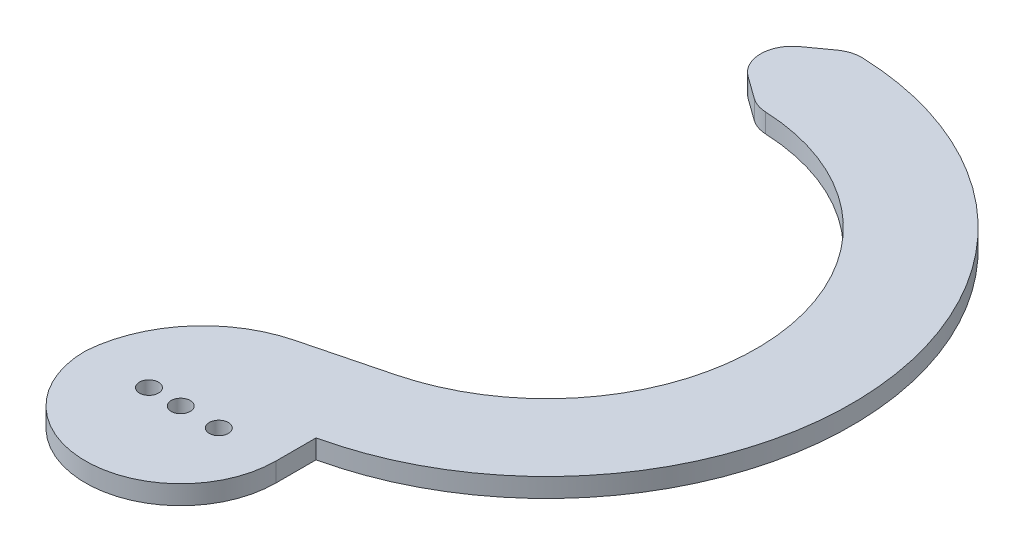
ISO-10303-21;
HEADER;
FILE_DESCRIPTION(('STEP AP214'),'2;1');
FILE_NAME('part.step','',(''),(''),'','','');
FILE_SCHEMA(('AUTOMOTIVE_DESIGN { 1 0 10303 214 1 1 1 1 }'));
ENDSEC;
DATA;
#1=APPLICATION_CONTEXT('core data for automotive mechanical design processes');
#2=APPLICATION_PROTOCOL_DEFINITION('international standard','automotive_design',2000,#1);
#3=PRODUCT_CONTEXT('',#1,'mechanical');
#4=PRODUCT('Part','Part','',(#3));
#5=PRODUCT_RELATED_PRODUCT_CATEGORY('part','',(#4));
#6=PRODUCT_DEFINITION_FORMATION('','',#4);
#7=PRODUCT_DEFINITION_CONTEXT('part definition',#1,'design');
#8=PRODUCT_DEFINITION('design','',#6,#7);
#9=PRODUCT_DEFINITION_SHAPE('','',#8);
#10=(LENGTH_UNIT() NAMED_UNIT(*) SI_UNIT(.MILLI.,.METRE.));
#11=(NAMED_UNIT(*) PLANE_ANGLE_UNIT() SI_UNIT($,.RADIAN.));
#12=(NAMED_UNIT(*) SI_UNIT($,.STERADIAN.) SOLID_ANGLE_UNIT());
#13=UNCERTAINTY_MEASURE_WITH_UNIT(LENGTH_MEASURE(1.E-05),#10,'distance_accuracy_value','');
#14=(GEOMETRIC_REPRESENTATION_CONTEXT(3) GLOBAL_UNCERTAINTY_ASSIGNED_CONTEXT((#13)) GLOBAL_UNIT_ASSIGNED_CONTEXT((#10,
#11,#12)) REPRESENTATION_CONTEXT('',''));
#15=CARTESIAN_POINT('',(0.,0.,0.));
#16=DIRECTION('',(0.,0.,1.));
#17=DIRECTION('',(1.,0.,0.));
#18=AXIS2_PLACEMENT_3D('',#15,#16,#17);
#19=CARTESIAN_POINT('',(10.5,3.,0.));
#20=DIRECTION('',(-1.,0.,0.));
#21=DIRECTION('',(0.,0.,1.));
#22=AXIS2_PLACEMENT_3D('',#19,#20,#21);
#23=PLANE('',#22);
#24=DIRECTION('',(0.,0.,-1.));
#25=VECTOR('',#24,1.);
#26=CARTESIAN_POINT('',(10.5,0.,0.));
#27=LINE('',#26,#25);
#28=CARTESIAN_POINT('',(10.5,0.,53.14));
#29=VERTEX_POINT('',#28);
#30=CARTESIAN_POINT('',(10.5,0.,46.837484987988));
#31=VERTEX_POINT('',#30);
#32=EDGE_CURVE('E176',#29,#31,#27,.T.);
#33=ORIENTED_EDGE('',*,*,#32,.T.);
#34=DIRECTION('',(0.,-1.,0.));
#35=VECTOR('',#34,1.);
#36=CARTESIAN_POINT('',(10.5,3.,46.837484987988));
#37=LINE('',#36,#35);
#38=CARTESIAN_POINT('',(10.5,3.,46.837484987988));
#39=VERTEX_POINT('',#38);
#40=EDGE_CURVE('E211',#39,#31,#37,.T.);
#41=ORIENTED_EDGE('',*,*,#40,.F.);
#42=DIRECTION('',(0.,0.,-1.));
#43=VECTOR('',#42,1.);
#44=CARTESIAN_POINT('',(10.5,3.,0.));
#45=LINE('',#44,#43);
#46=CARTESIAN_POINT('',(10.5,3.,53.14));
#47=VERTEX_POINT('',#46);
#48=EDGE_CURVE('E320',#47,#39,#45,.T.);
#49=ORIENTED_EDGE('',*,*,#48,.F.);
#50=DIRECTION('',(0.,-1.,0.));
#51=VECTOR('',#50,1.);
#52=CARTESIAN_POINT('',(10.5,3.,53.14));
#53=LINE('',#52,#51);
#54=EDGE_CURVE('E172',#47,#29,#53,.T.);
#55=ORIENTED_EDGE('',*,*,#54,.T.);
#56=EDGE_LOOP('',(#33,#41,#49,#55));
#57=FACE_BOUND('',#56,.T.);
#58=ADVANCED_FACE('F45',(#57),#23,.F.);
#59=CARTESIAN_POINT('',(0.,3.,0.));
#60=DIRECTION('',(0.,-1.,0.));
#61=DIRECTION('',(0.,0.,-1.));
#62=AXIS2_PLACEMENT_3D('',#59,#60,#61);
#63=CYLINDRICAL_SURFACE('',#62,48.);
#64=CARTESIAN_POINT('',(0.,0.,0.));
#65=DIRECTION('',(0.,1.,0.));
#66=DIRECTION('',(0.,0.,1.));
#67=AXIS2_PLACEMENT_3D('',#64,#65,#66);
#68=CIRCLE('',#67,48.);
#69=CARTESIAN_POINT('',(1.75489275571207,0.,-47.9679096002312));
#70=VERTEX_POINT('',#69);
#71=EDGE_CURVE('E180',#31,#70,#68,.T.);
#72=ORIENTED_EDGE('',*,*,#71,.T.);
#73=DIRECTION('',(0.,-1.,0.));
#74=VECTOR('',#73,1.);
#75=CARTESIAN_POINT('',(1.75489275571207,3.,-47.9679096002312));
#76=LINE('',#75,#74);
#77=CARTESIAN_POINT('',(1.75489275571207,3.,-47.9679096002312));
#78=VERTEX_POINT('',#77);
#79=EDGE_CURVE('E239',#70,#78,#76,.F.);
#80=ORIENTED_EDGE('',*,*,#79,.T.);
#81=CARTESIAN_POINT('',(0.,3.,0.));
#82=DIRECTION('',(0.,1.,0.));
#83=DIRECTION('',(0.,0.,1.));
#84=AXIS2_PLACEMENT_3D('',#81,#82,#83);
#85=CIRCLE('',#84,48.);
#86=EDGE_CURVE('E319',#39,#78,#85,.T.);
#87=ORIENTED_EDGE('',*,*,#86,.F.);
#88=ORIENTED_EDGE('',*,*,#40,.T.);
#89=EDGE_LOOP('',(#72,#80,#87,#88));
#90=FACE_BOUND('',#89,.T.);
#91=ADVANCED_FACE('F271',(#90),#63,.T.);
#92=CARTESIAN_POINT('',(-22.7569674268065,3.,-31.6236758545514));
#93=DIRECTION('',(-0.584100521911124,0.,-0.811681329280866));
#94=DIRECTION('',(-0.811681329280866,0.,0.584100521911124));
#95=AXIS2_PLACEMENT_3D('',#92,#93,#94);
#96=PLANE('',#95);
#97=DIRECTION('',(0.811681329280866,0.,-0.584100521911124));
#98=VECTOR('',#97,1.);
#99=CARTESIAN_POINT('',(-22.7569674268065,3.,-31.6236758545514));
#100=LINE('',#99,#98);
#101=CARTESIAN_POINT('',(-4.78252794390728,3.,-44.5584066464043));
#102=VERTEX_POINT('',#101);
#103=CARTESIAN_POINT('',(-1.34841118256355,3.,-47.0296589966115));
#104=VERTEX_POINT('',#103);
#105=EDGE_CURVE('E161',#102,#104,#100,.T.);
#106=ORIENTED_EDGE('',*,*,#105,.T.);
#107=DIRECTION('',(0.,1.,0.));
#108=VECTOR('',#107,1.);
#109=CARTESIAN_POINT('',(-1.34841118256356,0.,-47.0296589966115));
#110=LINE('',#109,#108);
#111=CARTESIAN_POINT('',(-1.34841118256355,0.,-47.0296589966115));
#112=VERTEX_POINT('',#111);
#113=EDGE_CURVE('E229',#104,#112,#110,.F.);
#114=ORIENTED_EDGE('',*,*,#113,.T.);
#115=DIRECTION('',(0.811681329280866,0.,-0.584100521911124));
#116=VECTOR('',#115,1.);
#117=CARTESIAN_POINT('',(-22.7569674268065,0.,-31.6236758545514));
#118=LINE('',#117,#116);
#119=CARTESIAN_POINT('',(-4.78252794390728,0.,-44.5584066464043));
#120=VERTEX_POINT('',#119);
#121=EDGE_CURVE('E184',#120,#112,#118,.T.);
#122=ORIENTED_EDGE('',*,*,#121,.F.);
#123=DIRECTION('',(0.,-1.,0.));
#124=VECTOR('',#123,1.);
#125=CARTESIAN_POINT('',(-4.78252794390729,3.,-44.5584066464043));
#126=LINE('',#125,#124);
#127=EDGE_CURVE('E222',#120,#102,#126,.F.);
#128=ORIENTED_EDGE('',*,*,#127,.T.);
#129=EDGE_LOOP('',(#106,#114,#122,#128));
#130=FACE_BOUND('',#129,.T.);
#131=ADVANCED_FACE('F277',(#130),#96,.T.);
#132=CARTESIAN_POINT('',(15.6454151059294,3.,-21.741277150004));
#133=DIRECTION('',(-0.584100521911124,0.,0.811681329280866));
#134=DIRECTION('',(0.811681329280866,0.,0.584100521911124));
#135=AXIS2_PLACEMENT_3D('',#132,#133,#134);
#136=PLANE('',#135);
#137=DIRECTION('',(-0.811681329280866,0.,-0.584100521911124));
#138=VECTOR('',#137,1.);
#139=CARTESIAN_POINT('',(15.6454151059294,0.,-21.741277150004));
#140=LINE('',#139,#138);
#141=CARTESIAN_POINT('',(-1.25789516049757,0.,-33.9052040415997));
#142=VERTEX_POINT('',#141);
#143=CARTESIAN_POINT('',(-4.7825279439073,0.,-36.4415933535957));
#144=VERTEX_POINT('',#143);
#145=EDGE_CURVE('E188',#142,#144,#140,.T.);
#146=ORIENTED_EDGE('',*,*,#145,.F.);
#147=DIRECTION('',(0.,-1.,0.));
#148=VECTOR('',#147,1.);
#149=CARTESIAN_POINT('',(-1.25789516049755,3.,-33.9052040415997));
#150=LINE('',#149,#148);
#151=CARTESIAN_POINT('',(-1.25789516049757,3.,-33.9052040415997));
#152=VERTEX_POINT('',#151);
#153=EDGE_CURVE('E250',#142,#152,#150,.F.);
#154=ORIENTED_EDGE('',*,*,#153,.T.);
#155=DIRECTION('',(-0.811681329280866,0.,-0.584100521911124));
#156=VECTOR('',#155,1.);
#157=CARTESIAN_POINT('',(15.6454151059294,3.,-21.741277150004));
#158=LINE('',#157,#156);
#159=CARTESIAN_POINT('',(-4.7825279439073,3.,-36.4415933535957));
#160=VERTEX_POINT('',#159);
#161=EDGE_CURVE('E155',#152,#160,#158,.T.);
#162=ORIENTED_EDGE('',*,*,#161,.T.);
#163=DIRECTION('',(0.,-1.,0.));
#164=VECTOR('',#163,1.);
#165=CARTESIAN_POINT('',(-4.78252794390729,3.,-36.4415933535957));
#166=LINE('',#165,#164);
#167=EDGE_CURVE('E215',#160,#144,#166,.T.);
#168=ORIENTED_EDGE('',*,*,#167,.T.);
#169=EDGE_LOOP('',(#146,#154,#162,#168));
#170=FACE_BOUND('',#169,.T.);
#171=ADVANCED_FACE('F305',(#170),#136,.T.);
#172=CARTESIAN_POINT('',(0.,3.,0.));
#173=DIRECTION('',(0.,-1.,0.));
#174=DIRECTION('',(0.,0.,-1.));
#175=AXIS2_PLACEMENT_3D('',#172,#173,#174);
#176=CYLINDRICAL_SURFACE('',#175,32.9999999999999);
#177=DIRECTION('',(0.,1.,0.));
#178=VECTOR('',#177,1.);
#179=CARTESIAN_POINT('',(8.20157023213472,-7.,31.9645779845027));
#180=LINE('',#179,#178);
#181=CARTESIAN_POINT('',(8.20157023213473,0.,31.9645779845027));
#182=VERTEX_POINT('',#181);
#183=CARTESIAN_POINT('',(8.20157023213472,3.,31.9645779845027));
#184=VERTEX_POINT('',#183);
#185=EDGE_CURVE('E131',#182,#184,#180,.T.);
#186=ORIENTED_EDGE('',*,*,#185,.T.);
#187=CARTESIAN_POINT('',(0.,3.,0.));
#188=DIRECTION('',(0.,1.,0.));
#189=DIRECTION('',(0.,0.,1.));
#190=AXIS2_PLACEMENT_3D('',#187,#188,#189);
#191=CIRCLE('',#190,32.9999999999999);
#192=CARTESIAN_POINT('',(1.4438433110241,3.,-32.9683987553719));
#193=VERTEX_POINT('',#192);
#194=EDGE_CURVE('E141',#184,#193,#191,.T.);
#195=ORIENTED_EDGE('',*,*,#194,.T.);
#196=DIRECTION('',(0.,-1.,0.));
#197=VECTOR('',#196,1.);
#198=CARTESIAN_POINT('',(1.4438433110241,3.,-32.9683987553719));
#199=LINE('',#198,#197);
#200=CARTESIAN_POINT('',(1.4438433110241,0.,-32.9683987553719));
#201=VERTEX_POINT('',#200);
#202=EDGE_CURVE('E247',#193,#201,#199,.T.);
#203=ORIENTED_EDGE('',*,*,#202,.T.);
#204=CARTESIAN_POINT('',(0.,0.,0.));
#205=DIRECTION('',(0.,1.,0.));
#206=DIRECTION('',(0.,0.,1.));
#207=AXIS2_PLACEMENT_3D('',#204,#205,#206);
#208=CIRCLE('',#207,32.9999999999999);
#209=EDGE_CURVE('E143',#182,#201,#208,.T.);
#210=ORIENTED_EDGE('',*,*,#209,.F.);
#211=EDGE_LOOP('',(#186,#195,#203,#210));
#212=FACE_BOUND('',#211,.T.);
#213=ADVANCED_FACE('F139',(#212),#176,.F.);
#214=CARTESIAN_POINT('',(-4.5,3.,53.14));
#215=DIRECTION('',(0.,-1.,0.));
#216=DIRECTION('',(0.,0.,-1.));
#217=AXIS2_PLACEMENT_3D('',#214,#215,#216);
#218=CYLINDRICAL_SURFACE('',#217,1.5);
#219=CARTESIAN_POINT('',(-4.5,3.,53.14));
#220=DIRECTION('',(0.,1.,0.));
#221=DIRECTION('',(0.,0.,1.));
#222=AXIS2_PLACEMENT_3D('',#219,#220,#221);
#223=CIRCLE('',#222,1.5);
#224=CARTESIAN_POINT('',(-4.5,3.,54.64));
#225=VERTEX_POINT('',#224);
#226=EDGE_CURVE('E159',#225,#225,#223,.T.);
#227=ORIENTED_EDGE('',*,*,#226,.T.);
#228=EDGE_LOOP('',(#227));
#229=FACE_BOUND('',#228,.T.);
#230=CARTESIAN_POINT('',(-4.5,0.,53.14));
#231=DIRECTION('',(0.,1.,0.));
#232=DIRECTION('',(0.,0.,1.));
#233=AXIS2_PLACEMENT_3D('',#230,#231,#232);
#234=CIRCLE('',#233,1.5);
#235=CARTESIAN_POINT('',(-4.5,0.,54.64));
#236=VERTEX_POINT('',#235);
#237=EDGE_CURVE('E196',#236,#236,#234,.T.);
#238=ORIENTED_EDGE('',*,*,#237,.F.);
#239=EDGE_LOOP('',(#238));
#240=FACE_BOUND('',#239,.T.);
#241=ADVANCED_FACE('F349',(#229,#240),#218,.F.);
#242=CARTESIAN_POINT('',(-4.5,3.,53.14));
#243=DIRECTION('',(0.,-1.,0.));
#244=DIRECTION('',(0.,0.,-1.));
#245=AXIS2_PLACEMENT_3D('',#242,#243,#244);
#246=CYLINDRICAL_SURFACE('',#245,15.);
#247=CARTESIAN_POINT('',(-4.5,0.,53.14));
#248=DIRECTION('',(0.,1.,0.));
#249=DIRECTION('',(0.,0.,1.));
#250=AXIS2_PLACEMENT_3D('',#247,#248,#249);
#251=CIRCLE('',#250,15.);
#252=CARTESIAN_POINT('',(-19.5,0.,53.14));
#253=VERTEX_POINT('',#252);
#254=EDGE_CURVE('E193',#253,#29,#251,.T.);
#255=ORIENTED_EDGE('',*,*,#254,.T.);
#256=ORIENTED_EDGE('',*,*,#54,.F.);
#257=CARTESIAN_POINT('',(-4.5,3.,53.14));
#258=DIRECTION('',(0.,1.,0.));
#259=DIRECTION('',(0.,0.,1.));
#260=AXIS2_PLACEMENT_3D('',#257,#258,#259);
#261=CIRCLE('',#260,15.);
#262=CARTESIAN_POINT('',(-19.5,3.,53.14));
#263=VERTEX_POINT('',#262);
#264=EDGE_CURVE('E154',#263,#47,#261,.T.);
#265=ORIENTED_EDGE('',*,*,#264,.F.);
#266=DIRECTION('',(0.,-1.,0.));
#267=VECTOR('',#266,1.);
#268=CARTESIAN_POINT('',(-19.5,3.,53.14));
#269=LINE('',#268,#267);
#270=EDGE_CURVE('E208',#263,#253,#269,.T.);
#271=ORIENTED_EDGE('',*,*,#270,.T.);
#272=EDGE_LOOP('',(#255,#256,#265,#271));
#273=FACE_BOUND('',#272,.T.);
#274=ADVANCED_FACE('F262',(#273),#246,.T.);
#275=CARTESIAN_POINT('',(1.5,3.,53.14));
#276=DIRECTION('',(0.,-1.,0.));
#277=DIRECTION('',(0.,0.,-1.));
#278=AXIS2_PLACEMENT_3D('',#275,#276,#277);
#279=CYLINDRICAL_SURFACE('',#278,1.5);
#280=CARTESIAN_POINT('',(1.5,3.,53.14));
#281=DIRECTION('',(0.,1.,0.));
#282=DIRECTION('',(0.,0.,1.));
#283=AXIS2_PLACEMENT_3D('',#280,#281,#282);
#284=CIRCLE('',#283,1.5);
#285=CARTESIAN_POINT('',(1.5,3.,54.64));
#286=VERTEX_POINT('',#285);
#287=EDGE_CURVE('E204',#286,#286,#284,.T.);
#288=ORIENTED_EDGE('',*,*,#287,.T.);
#289=EDGE_LOOP('',(#288));
#290=FACE_BOUND('',#289,.T.);
#291=CARTESIAN_POINT('',(1.5,0.,53.14));
#292=DIRECTION('',(0.,1.,0.));
#293=DIRECTION('',(0.,0.,1.));
#294=AXIS2_PLACEMENT_3D('',#291,#292,#293);
#295=CIRCLE('',#294,1.5);
#296=CARTESIAN_POINT('',(1.5,0.,54.64));
#297=VERTEX_POINT('',#296);
#298=EDGE_CURVE('E145',#297,#297,#295,.T.);
#299=ORIENTED_EDGE('',*,*,#298,.F.);
#300=EDGE_LOOP('',(#299));
#301=FACE_BOUND('',#300,.T.);
#302=ADVANCED_FACE('F282',(#290,#301),#279,.F.);
#303=CARTESIAN_POINT('',(-9.50000000000001,3.,53.14));
#304=DIRECTION('',(0.,-1.,0.));
#305=DIRECTION('',(0.,0.,-1.));
#306=AXIS2_PLACEMENT_3D('',#303,#304,#305);
#307=CYLINDRICAL_SURFACE('',#306,1.5);
#308=CARTESIAN_POINT('',(-9.50000000000001,3.,53.14));
#309=DIRECTION('',(0.,1.,0.));
#310=DIRECTION('',(0.,0.,1.));
#311=AXIS2_PLACEMENT_3D('',#308,#309,#310);
#312=CIRCLE('',#311,1.5);
#313=CARTESIAN_POINT('',(-9.50000000000001,3.,54.64));
#314=VERTEX_POINT('',#313);
#315=EDGE_CURVE('E168',#314,#314,#312,.T.);
#316=ORIENTED_EDGE('',*,*,#315,.T.);
#317=EDGE_LOOP('',(#316));
#318=FACE_BOUND('',#317,.T.);
#319=CARTESIAN_POINT('',(-9.50000000000001,0.,53.14));
#320=DIRECTION('',(0.,1.,0.));
#321=DIRECTION('',(0.,0.,1.));
#322=AXIS2_PLACEMENT_3D('',#319,#320,#321);
#323=CIRCLE('',#322,1.5);
#324=CARTESIAN_POINT('',(-9.50000000000001,0.,54.64));
#325=VERTEX_POINT('',#324);
#326=EDGE_CURVE('E200',#325,#325,#323,.T.);
#327=ORIENTED_EDGE('',*,*,#326,.F.);
#328=EDGE_LOOP('',(#327));
#329=FACE_BOUND('',#328,.T.);
#330=ADVANCED_FACE('F285',(#318,#329),#307,.F.);
#331=CARTESIAN_POINT('',(0.,3.,0.));
#332=DIRECTION('',(0.,1.,0.));
#333=DIRECTION('',(0.,0.,1.));
#334=AXIS2_PLACEMENT_3D('',#331,#332,#333);
#335=PLANE('',#334);
#336=DIRECTION('',(0.968623575287964,0.,-0.248532431276811));
#337=VECTOR('',#336,1.);
#338=CARTESIAN_POINT('',(8.20157023213472,3.,31.9645779845027));
#339=LINE('',#338,#337);
#340=CARTESIAN_POINT('',(-4.52417540837722,3.,35.2297891403498));
#341=VERTEX_POINT('',#340);
#342=EDGE_CURVE('E128',#341,#184,#339,.T.);
#343=ORIENTED_EDGE('',*,*,#342,.F.);
#344=CARTESIAN_POINT('',(0.446473217158991,3.,54.602260646109));
#345=DIRECTION('',(0.,1.,0.));
#346=DIRECTION('',(0.,0.,1.));
#347=AXIS2_PLACEMENT_3D('',#344,#345,#346);
#348=CIRCLE('',#347,20.);
#349=EDGE_CURVE('E54',#341,#263,#348,.T.);
#350=ORIENTED_EDGE('',*,*,#349,.T.);
#351=ORIENTED_EDGE('',*,*,#264,.T.);
#352=ORIENTED_EDGE('',*,*,#48,.T.);
#353=ORIENTED_EDGE('',*,*,#86,.T.);
#354=CARTESIAN_POINT('',(1.57209142699206,3.,-42.9712523502071));
#355=DIRECTION('',(0.,1.,0.));
#356=DIRECTION('',(0.,0.,1.));
#357=AXIS2_PLACEMENT_3D('',#354,#355,#356);
#358=CIRCLE('',#357,5.);
#359=EDGE_CURVE('E244',#78,#104,#358,.T.);
#360=ORIENTED_EDGE('',*,*,#359,.T.);
#361=ORIENTED_EDGE('',*,*,#105,.F.);
#362=CARTESIAN_POINT('',(-1.86202533435167,3.,-40.5));
#363=DIRECTION('',(0.,1.,0.));
#364=DIRECTION('',(0.,0.,1.));
#365=AXIS2_PLACEMENT_3D('',#362,#363,#364);
#366=CIRCLE('',#365,5.);
#367=EDGE_CURVE('E225',#102,#160,#366,.T.);
#368=ORIENTED_EDGE('',*,*,#367,.T.);
#369=ORIENTED_EDGE('',*,*,#161,.F.);
#370=CARTESIAN_POINT('',(1.66260744905806,3.,-37.963610688004));
#371=DIRECTION('',(0.,1.,0.));
#372=DIRECTION('',(0.,0.,1.));
#373=AXIS2_PLACEMENT_3D('',#370,#371,#372);
#374=CIRCLE('',#373,5.);
#375=EDGE_CURVE('E151',#152,#193,#374,.T.);
#376=ORIENTED_EDGE('',*,*,#375,.T.);
#377=ORIENTED_EDGE('',*,*,#194,.F.);
#378=EDGE_LOOP('',(#343,#350,#351,#352,#353,#360,#361,#368,#369,#376,#377));
#379=FACE_BOUND('',#378,.T.);
#380=ORIENTED_EDGE('',*,*,#287,.F.);
#381=EDGE_LOOP('',(#380));
#382=FACE_BOUND('',#381,.T.);
#383=ORIENTED_EDGE('',*,*,#226,.F.);
#384=EDGE_LOOP('',(#383));
#385=FACE_BOUND('',#384,.T.);
#386=ORIENTED_EDGE('',*,*,#315,.F.);
#387=EDGE_LOOP('',(#386));
#388=FACE_BOUND('',#387,.T.);
#389=ADVANCED_FACE('F147',(#379,#382,#385,#388),#335,.T.);
#390=CARTESIAN_POINT('',(0.,0.,0.));
#391=DIRECTION('',(0.,1.,0.));
#392=DIRECTION('',(0.,0.,1.));
#393=AXIS2_PLACEMENT_3D('',#390,#391,#392);
#394=PLANE('',#393);
#395=ORIENTED_EDGE('',*,*,#298,.T.);
#396=EDGE_LOOP('',(#395));
#397=FACE_BOUND('',#396,.T.);
#398=ORIENTED_EDGE('',*,*,#254,.F.);
#399=CARTESIAN_POINT('',(0.446473217158991,0.,54.602260646109));
#400=DIRECTION('',(0.,1.,0.));
#401=DIRECTION('',(0.,0.,1.));
#402=AXIS2_PLACEMENT_3D('',#399,#400,#401);
#403=CIRCLE('',#402,20.);
#404=CARTESIAN_POINT('',(-4.52417540837722,0.,35.2297891403498));
#405=VERTEX_POINT('',#404);
#406=EDGE_CURVE('E11',#253,#405,#403,.F.);
#407=ORIENTED_EDGE('',*,*,#406,.T.);
#408=DIRECTION('',(0.968623575287964,0.,-0.24853243127681));
#409=VECTOR('',#408,1.);
#410=CARTESIAN_POINT('',(8.20157023213473,0.,31.9645779845027));
#411=LINE('',#410,#409);
#412=EDGE_CURVE('E253',#405,#182,#411,.T.);
#413=ORIENTED_EDGE('',*,*,#412,.T.);
#414=ORIENTED_EDGE('',*,*,#209,.T.);
#415=CARTESIAN_POINT('',(1.66260744905806,0.,-37.963610688004));
#416=DIRECTION('',(0.,1.,0.));
#417=DIRECTION('',(0.,0.,1.));
#418=AXIS2_PLACEMENT_3D('',#415,#416,#417);
#419=CIRCLE('',#418,5.);
#420=EDGE_CURVE('E233',#201,#142,#419,.F.);
#421=ORIENTED_EDGE('',*,*,#420,.T.);
#422=ORIENTED_EDGE('',*,*,#145,.T.);
#423=CARTESIAN_POINT('',(-1.86202533435167,0.,-40.5));
#424=DIRECTION('',(0.,1.,0.));
#425=DIRECTION('',(0.,0.,1.));
#426=AXIS2_PLACEMENT_3D('',#423,#424,#425);
#427=CIRCLE('',#426,5.);
#428=EDGE_CURVE('E219',#144,#120,#427,.F.);
#429=ORIENTED_EDGE('',*,*,#428,.T.);
#430=ORIENTED_EDGE('',*,*,#121,.T.);
#431=CARTESIAN_POINT('',(1.57209142699206,0.,-42.9712523502071));
#432=DIRECTION('',(0.,1.,0.));
#433=DIRECTION('',(0.,0.,1.));
#434=AXIS2_PLACEMENT_3D('',#431,#432,#433);
#435=CIRCLE('',#434,5.);
#436=EDGE_CURVE('E236',#112,#70,#435,.F.);
#437=ORIENTED_EDGE('',*,*,#436,.T.);
#438=ORIENTED_EDGE('',*,*,#71,.F.);
#439=ORIENTED_EDGE('',*,*,#32,.F.);
#440=EDGE_LOOP('',(#398,#407,#413,#414,#421,#422,#429,#430,#437,#438,#439));
#441=FACE_BOUND('',#440,.T.);
#442=ORIENTED_EDGE('',*,*,#237,.T.);
#443=EDGE_LOOP('',(#442));
#444=FACE_BOUND('',#443,.T.);
#445=ORIENTED_EDGE('',*,*,#326,.T.);
#446=EDGE_LOOP('',(#445));
#447=FACE_BOUND('',#446,.T.);
#448=ADVANCED_FACE('F291',(#397,#441,#444,#447),#394,.F.);
#449=CARTESIAN_POINT('',(-1.86202533435167,3.,-40.5));
#450=DIRECTION('',(0.,-1.,0.));
#451=DIRECTION('',(0.,0.,-1.));
#452=AXIS2_PLACEMENT_3D('',#449,#450,#451);
#453=CYLINDRICAL_SURFACE('',#452,5.);
#454=ORIENTED_EDGE('',*,*,#367,.F.);
#455=ORIENTED_EDGE('',*,*,#127,.F.);
#456=ORIENTED_EDGE('',*,*,#428,.F.);
#457=ORIENTED_EDGE('',*,*,#167,.F.);
#458=EDGE_LOOP('',(#454,#455,#456,#457));
#459=FACE_BOUND('',#458,.T.);
#460=ADVANCED_FACE('F287',(#459),#453,.T.);
#461=CARTESIAN_POINT('',(1.57209142699206,3.,-42.9712523502071));
#462=DIRECTION('',(0.,-1.,0.));
#463=DIRECTION('',(0.,0.,-1.));
#464=AXIS2_PLACEMENT_3D('',#461,#462,#463);
#465=CYLINDRICAL_SURFACE('',#464,5.);
#466=ORIENTED_EDGE('',*,*,#359,.F.);
#467=ORIENTED_EDGE('',*,*,#79,.F.);
#468=ORIENTED_EDGE('',*,*,#436,.F.);
#469=ORIENTED_EDGE('',*,*,#113,.F.);
#470=EDGE_LOOP('',(#466,#467,#468,#469));
#471=FACE_BOUND('',#470,.T.);
#472=ADVANCED_FACE('F290',(#471),#465,.T.);
#473=CARTESIAN_POINT('',(1.66260744905806,3.,-37.963610688004));
#474=DIRECTION('',(0.,-1.,0.));
#475=DIRECTION('',(0.,0.,-1.));
#476=AXIS2_PLACEMENT_3D('',#473,#474,#475);
#477=CYLINDRICAL_SURFACE('',#476,5.);
#478=ORIENTED_EDGE('',*,*,#375,.F.);
#479=ORIENTED_EDGE('',*,*,#153,.F.);
#480=ORIENTED_EDGE('',*,*,#420,.F.);
#481=ORIENTED_EDGE('',*,*,#202,.F.);
#482=EDGE_LOOP('',(#478,#479,#480,#481));
#483=FACE_BOUND('',#482,.T.);
#484=ADVANCED_FACE('F268',(#483),#477,.T.);
#485=CARTESIAN_POINT('',(8.20157023213472,-7.,31.9645779845027));
#486=DIRECTION('',(0.24853243127681,0.,0.968623575287964));
#487=DIRECTION('',(0.968623575287964,0.,-0.24853243127681));
#488=AXIS2_PLACEMENT_3D('',#485,#486,#487);
#489=PLANE('',#488);
#490=ORIENTED_EDGE('',*,*,#412,.F.);
#491=DIRECTION('',(0.,-1.,0.));
#492=VECTOR('',#491,1.);
#493=CARTESIAN_POINT('',(-4.52417540837722,-7.,35.2297891403498));
#494=LINE('',#493,#492);
#495=EDGE_CURVE('E133',#405,#341,#494,.F.);
#496=ORIENTED_EDGE('',*,*,#495,.T.);
#497=ORIENTED_EDGE('',*,*,#342,.T.);
#498=ORIENTED_EDGE('',*,*,#185,.F.);
#499=EDGE_LOOP('',(#490,#496,#497,#498));
#500=FACE_BOUND('',#499,.T.);
#501=ADVANCED_FACE('F130',(#500),#489,.F.);
#502=CARTESIAN_POINT('',(0.446473217158991,3.,54.602260646109));
#503=DIRECTION('',(0.,-1.,0.));
#504=DIRECTION('',(0.,0.,-1.));
#505=AXIS2_PLACEMENT_3D('',#502,#503,#504);
#506=CYLINDRICAL_SURFACE('',#505,20.);
#507=ORIENTED_EDGE('',*,*,#406,.F.);
#508=ORIENTED_EDGE('',*,*,#270,.F.);
#509=ORIENTED_EDGE('',*,*,#349,.F.);
#510=ORIENTED_EDGE('',*,*,#495,.F.);
#511=EDGE_LOOP('',(#507,#508,#509,#510));
#512=FACE_BOUND('',#511,.T.);
#513=ADVANCED_FACE('F47',(#512),#506,.T.);
#514=CLOSED_SHELL('',(#58,#91,#131,#171,#213,#241,#274,#302,#330,#389,#448,#460,#472,#484,#501,#513));
#515=MANIFOLD_SOLID_BREP('B2',#514);
#516=ADVANCED_BREP_SHAPE_REPRESENTATION('',(#18,#515),#14);
#517=SHAPE_DEFINITION_REPRESENTATION(#9,#516);
ENDSEC;
END-ISO-10303-21;
